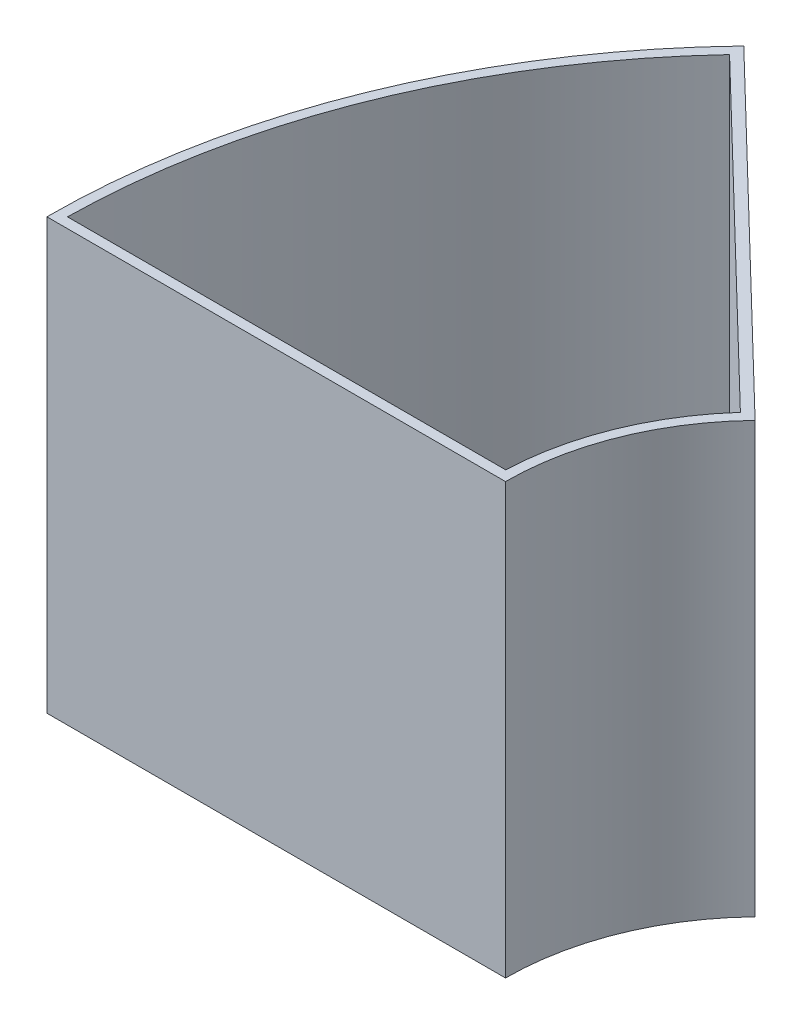
ISO-10303-21;
HEADER;
FILE_DESCRIPTION(('STEP AP214'),'2;1');
FILE_NAME('part.step','',(''),(''),'','','');
FILE_SCHEMA(('AUTOMOTIVE_DESIGN { 1 0 10303 214 1 1 1 1 }'));
ENDSEC;
DATA;
#1=APPLICATION_CONTEXT('core data for automotive mechanical design processes');
#2=APPLICATION_PROTOCOL_DEFINITION('international standard','automotive_design',2000,#1);
#3=PRODUCT_CONTEXT('',#1,'mechanical');
#4=PRODUCT('Part','Part','',(#3));
#5=PRODUCT_RELATED_PRODUCT_CATEGORY('part','',(#4));
#6=PRODUCT_DEFINITION_FORMATION('','',#4);
#7=PRODUCT_DEFINITION_CONTEXT('part definition',#1,'design');
#8=PRODUCT_DEFINITION('design','',#6,#7);
#9=PRODUCT_DEFINITION_SHAPE('','',#8);
#10=(LENGTH_UNIT() NAMED_UNIT(*) SI_UNIT(.MILLI.,.METRE.));
#11=(NAMED_UNIT(*) PLANE_ANGLE_UNIT() SI_UNIT($,.RADIAN.));
#12=(NAMED_UNIT(*) SI_UNIT($,.STERADIAN.) SOLID_ANGLE_UNIT());
#13=UNCERTAINTY_MEASURE_WITH_UNIT(LENGTH_MEASURE(1.E-05),#10,'distance_accuracy_value','');
#14=(GEOMETRIC_REPRESENTATION_CONTEXT(3) GLOBAL_UNCERTAINTY_ASSIGNED_CONTEXT((#13)) GLOBAL_UNIT_ASSIGNED_CONTEXT((#10,
#11,#12)) REPRESENTATION_CONTEXT('',''));
#15=CARTESIAN_POINT('',(0.,0.,0.));
#16=DIRECTION('',(0.,0.,1.));
#17=DIRECTION('',(1.,0.,0.));
#18=AXIS2_PLACEMENT_3D('',#15,#16,#17);
#19=CARTESIAN_POINT('',(0.,-2.,0.));
#20=DIRECTION('',(0.,-1.,0.));
#21=DIRECTION('',(0.,0.,-1.));
#22=AXIS2_PLACEMENT_3D('',#19,#20,#21);
#23=PLANE('',#22);
#24=CARTESIAN_POINT('',(0.,-2.,0.));
#25=DIRECTION('',(0.,1.,0.));
#26=DIRECTION('',(0.,0.,-1.));
#27=AXIS2_PLACEMENT_3D('',#24,#25,#26);
#28=CIRCLE('',#27,25.);
#29=CARTESIAN_POINT('',(-17.9834950084663,-2.,-17.366459261475));
#30=VERTEX_POINT('',#29);
#31=CARTESIAN_POINT('',(-25.,-2.,0.));
#32=VERTEX_POINT('',#31);
#33=EDGE_CURVE('E146',#30,#32,#28,.T.);
#34=ORIENTED_EDGE('',*,*,#33,.T.);
#35=DIRECTION('',(-1.,0.,0.));
#36=VECTOR('',#35,1.);
#37=CARTESIAN_POINT('',(-25.,-2.,0.));
#38=LINE('',#37,#36);
#39=CARTESIAN_POINT('',(-69.8,-2.,0.));
#40=VERTEX_POINT('',#39);
#41=EDGE_CURVE('E150',#32,#40,#38,.T.);
#42=ORIENTED_EDGE('',*,*,#41,.T.);
#43=CARTESIAN_POINT('',(0.,-2.,0.));
#44=DIRECTION('',(0.,-1.,0.));
#45=DIRECTION('',(0.,0.,-1.));
#46=AXIS2_PLACEMENT_3D('',#43,#44,#45);
#47=CIRCLE('',#46,69.7999999999999);
#48=CARTESIAN_POINT('',(-50.2099180636378,-2.,-48.4871542580381));
#49=VERTEX_POINT('',#48);
#50=EDGE_CURVE('E158',#40,#49,#47,.T.);
#51=ORIENTED_EDGE('',*,*,#50,.T.);
#52=DIRECTION('',(0.71933980033865,0.,0.694658370458998));
#53=VECTOR('',#52,1.);
#54=CARTESIAN_POINT('',(-17.9834950084663,-2.,-17.366459261475));
#55=LINE('',#54,#53);
#56=EDGE_CURVE('E161',#49,#30,#55,.T.);
#57=ORIENTED_EDGE('',*,*,#56,.T.);
#58=EDGE_LOOP('',(#34,#42,#51,#57));
#59=FACE_BOUND('',#58,.T.);
#60=DIRECTION('',(-0.819152044288988,0.,-0.573576436351052));
#61=VECTOR('',#60,1.);
#62=CARTESIAN_POINT('',(-38.9097221037269,-2.,-27.244880726675));
#63=LINE('',#62,#61);
#64=CARTESIAN_POINT('',(-30.718201660837,-2.,-21.5091163631645));
#65=VERTEX_POINT('',#64);
#66=CARTESIAN_POINT('',(-38.9097221037269,-2.,-27.244880726675));
#67=VERTEX_POINT('',#66);
#68=EDGE_CURVE('E141',#65,#67,#63,.T.);
#69=ORIENTED_EDGE('',*,*,#68,.T.);
#70=CARTESIAN_POINT('',(4.5102810375397E-13,-2.,0.));
#71=DIRECTION('',(0.,1.,0.));
#72=DIRECTION('',(0.,0.,-1.));
#73=AXIS2_PLACEMENT_3D('',#70,#71,#72);
#74=CIRCLE('',#73,47.5000000000004);
#75=CARTESIAN_POINT('',(-46.915196178269,-2.,-7.43063708941125));
#76=VERTEX_POINT('',#75);
#77=EDGE_CURVE('E52',#67,#76,#74,.T.);
#78=ORIENTED_EDGE('',*,*,#77,.T.);
#79=DIRECTION('',(0.987688340595137,0.,0.156434465040237));
#80=VECTOR('',#79,1.);
#81=CARTESIAN_POINT('',(-46.915196178269,-2.,-7.43063708941125));
#82=LINE('',#81,#80);
#83=CARTESIAN_POINT('',(-37.0383127723176,-2.,-5.86629243900886));
#84=VERTEX_POINT('',#83);
#85=EDGE_CURVE('E145',#76,#84,#82,.T.);
#86=ORIENTED_EDGE('',*,*,#85,.T.);
#87=CARTESIAN_POINT('',(0.,-2.,0.));
#88=DIRECTION('',(0.,-1.,0.));
#89=DIRECTION('',(0.,0.,-1.));
#90=AXIS2_PLACEMENT_3D('',#87,#88,#89);
#91=CIRCLE('',#90,37.5000000000001);
#92=EDGE_CURVE('E417',#84,#65,#91,.T.);
#93=ORIENTED_EDGE('',*,*,#92,.T.);
#94=EDGE_LOOP('',(#69,#78,#86,#93));
#95=FACE_BOUND('',#94,.T.);
#96=ADVANCED_FACE('F37',(#59,#95),#23,.T.);
#97=CARTESIAN_POINT('',(0.,40.,0.));
#98=DIRECTION('',(0.,-1.,0.));
#99=DIRECTION('',(0.,0.,-1.));
#100=AXIS2_PLACEMENT_3D('',#97,#98,#99);
#101=PLANE('',#100);
#102=CARTESIAN_POINT('',(0.,40.,0.));
#103=DIRECTION('',(0.,-1.,0.));
#104=DIRECTION('',(0.,0.,-1.));
#105=AXIS2_PLACEMENT_3D('',#102,#103,#104);
#106=CIRCLE('',#105,25.);
#107=CARTESIAN_POINT('',(-25.,40.,0.));
#108=VERTEX_POINT('',#107);
#109=CARTESIAN_POINT('',(-17.9834950084663,40.,-17.366459261475));
#110=VERTEX_POINT('',#109);
#111=EDGE_CURVE('E171',#108,#110,#106,.T.);
#112=ORIENTED_EDGE('',*,*,#111,.T.);
#113=DIRECTION('',(-0.71933980033865,0.,-0.694658370458998));
#114=VECTOR('',#113,1.);
#115=CARTESIAN_POINT('',(-50.2099180636378,40.,-48.4871542580381));
#116=LINE('',#115,#114);
#117=CARTESIAN_POINT('',(-50.2099180636378,40.,-48.4871542580381));
#118=VERTEX_POINT('',#117);
#119=EDGE_CURVE('E194',#110,#118,#116,.T.);
#120=ORIENTED_EDGE('',*,*,#119,.T.);
#121=CARTESIAN_POINT('',(0.,40.,0.));
#122=DIRECTION('',(0.,1.,0.));
#123=DIRECTION('',(0.,0.,-1.));
#124=AXIS2_PLACEMENT_3D('',#121,#122,#123);
#125=CIRCLE('',#124,69.8);
#126=CARTESIAN_POINT('',(-69.8,40.,0.));
#127=VERTEX_POINT('',#126);
#128=EDGE_CURVE('E196',#118,#127,#125,.T.);
#129=ORIENTED_EDGE('',*,*,#128,.T.);
#130=DIRECTION('',(1.,0.,0.));
#131=VECTOR('',#130,1.);
#132=CARTESIAN_POINT('',(-25.,40.,0.));
#133=LINE('',#132,#131);
#134=EDGE_CURVE('E198',#127,#108,#133,.T.);
#135=ORIENTED_EDGE('',*,*,#134,.T.);
#136=EDGE_LOOP('',(#112,#120,#129,#135));
#137=FACE_BOUND('',#136,.T.);
#138=CARTESIAN_POINT('',(0.,40.,0.));
#139=DIRECTION('',(0.,-1.,0.));
#140=DIRECTION('',(0.,0.,-1.));
#141=AXIS2_PLACEMENT_3D('',#138,#139,#140);
#142=CIRCLE('',#141,26.);
#143=CARTESIAN_POINT('',(-25.9807621135332,40.,-1.));
#144=VERTEX_POINT('',#143);
#145=CARTESIAN_POINT('',(-19.3836546018539,40.,-17.3284140727312));
#146=VERTEX_POINT('',#145);
#147=EDGE_CURVE('E185',#144,#146,#142,.T.);
#148=ORIENTED_EDGE('',*,*,#147,.F.);
#149=DIRECTION('',(1.,0.,0.));
#150=VECTOR('',#149,1.);
#151=CARTESIAN_POINT('',(0.,40.,-1.));
#152=LINE('',#151,#150);
#153=CARTESIAN_POINT('',(-68.7927321742639,40.,-0.999999999999995));
#154=VERTEX_POINT('',#153);
#155=EDGE_CURVE('E176',#154,#144,#152,.T.);
#156=ORIENTED_EDGE('',*,*,#155,.F.);
#157=CARTESIAN_POINT('',(0.,40.,0.));
#158=DIRECTION('',(0.,-1.,0.));
#159=DIRECTION('',(0.,0.,-1.));
#160=AXIS2_PLACEMENT_3D('',#157,#158,#159);
#161=CIRCLE('',#160,68.8);
#162=CARTESIAN_POINT('',(-50.1800085974442,40.,-47.0681074312578));
#163=VERTEX_POINT('',#162);
#164=EDGE_CURVE('E189',#163,#154,#161,.F.);
#165=ORIENTED_EDGE('',*,*,#164,.F.);
#166=DIRECTION('',(-0.71933980033865,0.,-0.694658370458998));
#167=VECTOR('',#166,1.);
#168=CARTESIAN_POINT('',(-0.694658370458983,40.,0.719339800338656));
#169=LINE('',#168,#167);
#170=EDGE_CURVE('E187',#146,#163,#169,.T.);
#171=ORIENTED_EDGE('',*,*,#170,.F.);
#172=EDGE_LOOP('',(#148,#156,#165,#171));
#173=FACE_BOUND('',#172,.T.);
#174=ADVANCED_FACE('F224',(#137,#173),#101,.F.);
#175=CARTESIAN_POINT('',(0.,40.,0.));
#176=DIRECTION('',(0.,-1.,0.));
#177=DIRECTION('',(0.,0.,-1.));
#178=AXIS2_PLACEMENT_3D('',#175,#176,#177);
#179=CYLINDRICAL_SURFACE('',#178,25.);
#180=DIRECTION('',(0.,-1.,0.));
#181=VECTOR('',#180,1.);
#182=CARTESIAN_POINT('',(-25.,40.,0.));
#183=LINE('',#182,#181);
#184=EDGE_CURVE('E200',#108,#32,#183,.T.);
#185=ORIENTED_EDGE('',*,*,#184,.T.);
#186=ORIENTED_EDGE('',*,*,#33,.F.);
#187=DIRECTION('',(0.,-1.,0.));
#188=VECTOR('',#187,1.);
#189=CARTESIAN_POINT('',(-17.9834950084663,40.,-17.366459261475));
#190=LINE('',#189,#188);
#191=EDGE_CURVE('E11',#110,#30,#190,.T.);
#192=ORIENTED_EDGE('',*,*,#191,.F.);
#193=ORIENTED_EDGE('',*,*,#111,.F.);
#194=EDGE_LOOP('',(#185,#186,#192,#193));
#195=FACE_BOUND('',#194,.T.);
#196=ADVANCED_FACE('F39',(#195),#179,.F.);
#197=CARTESIAN_POINT('',(-50.2099180636378,40.,-48.4871542580381));
#198=DIRECTION('',(-0.694658370458998,0.,0.71933980033865));
#199=DIRECTION('',(0.71933980033865,0.,0.694658370458998));
#200=AXIS2_PLACEMENT_3D('',#197,#198,#199);
#201=PLANE('',#200);
#202=ORIENTED_EDGE('',*,*,#191,.T.);
#203=ORIENTED_EDGE('',*,*,#56,.F.);
#204=DIRECTION('',(0.,-1.,0.));
#205=VECTOR('',#204,1.);
#206=CARTESIAN_POINT('',(-50.2099180636378,40.,-48.4871542580381));
#207=LINE('',#206,#205);
#208=EDGE_CURVE('E45',#118,#49,#207,.T.);
#209=ORIENTED_EDGE('',*,*,#208,.F.);
#210=ORIENTED_EDGE('',*,*,#119,.F.);
#211=EDGE_LOOP('',(#202,#203,#209,#210));
#212=FACE_BOUND('',#211,.T.);
#213=ADVANCED_FACE('F215',(#212),#201,.F.);
#214=CARTESIAN_POINT('',(0.,40.,0.));
#215=DIRECTION('',(0.,-1.,0.));
#216=DIRECTION('',(0.,0.,-1.));
#217=AXIS2_PLACEMENT_3D('',#214,#215,#216);
#218=CYLINDRICAL_SURFACE('',#217,69.8);
#219=ORIENTED_EDGE('',*,*,#208,.T.);
#220=ORIENTED_EDGE('',*,*,#50,.F.);
#221=DIRECTION('',(0.,-1.,0.));
#222=VECTOR('',#221,1.);
#223=CARTESIAN_POINT('',(-69.8,40.,0.));
#224=LINE('',#223,#222);
#225=EDGE_CURVE('E202',#127,#40,#224,.T.);
#226=ORIENTED_EDGE('',*,*,#225,.F.);
#227=ORIENTED_EDGE('',*,*,#128,.F.);
#228=EDGE_LOOP('',(#219,#220,#226,#227));
#229=FACE_BOUND('',#228,.T.);
#230=ADVANCED_FACE('F207',(#229),#218,.T.);
#231=CARTESIAN_POINT('',(-25.,40.,0.));
#232=DIRECTION('',(0.,0.,-1.));
#233=DIRECTION('',(-1.,0.,0.));
#234=AXIS2_PLACEMENT_3D('',#231,#232,#233);
#235=PLANE('',#234);
#236=ORIENTED_EDGE('',*,*,#225,.T.);
#237=ORIENTED_EDGE('',*,*,#41,.F.);
#238=ORIENTED_EDGE('',*,*,#184,.F.);
#239=ORIENTED_EDGE('',*,*,#134,.F.);
#240=EDGE_LOOP('',(#236,#237,#238,#239));
#241=FACE_BOUND('',#240,.T.);
#242=ADVANCED_FACE('F222',(#241),#235,.F.);
#243=CARTESIAN_POINT('',(0.,40.,0.));
#244=DIRECTION('',(0.,-1.,0.));
#245=DIRECTION('',(0.,0.,-1.));
#246=AXIS2_PLACEMENT_3D('',#243,#244,#245);
#247=CYLINDRICAL_SURFACE('',#246,26.);
#248=CARTESIAN_POINT('',(0.,1.,0.));
#249=DIRECTION('',(0.,-1.,0.));
#250=DIRECTION('',(0.,0.,-1.));
#251=AXIS2_PLACEMENT_3D('',#248,#249,#250);
#252=CIRCLE('',#251,26.);
#253=CARTESIAN_POINT('',(-25.9807621135332,1.,-1.));
#254=VERTEX_POINT('',#253);
#255=CARTESIAN_POINT('',(-19.3836546018539,1.,-17.3284140727312));
#256=VERTEX_POINT('',#255);
#257=EDGE_CURVE('E164',#254,#256,#252,.T.);
#258=ORIENTED_EDGE('',*,*,#257,.F.);
#259=DIRECTION('',(0.,-1.,0.));
#260=VECTOR('',#259,1.);
#261=CARTESIAN_POINT('',(-25.9807621135332,40.,-1.));
#262=LINE('',#261,#260);
#263=EDGE_CURVE('E173',#144,#254,#262,.T.);
#264=ORIENTED_EDGE('',*,*,#263,.F.);
#265=ORIENTED_EDGE('',*,*,#147,.T.);
#266=DIRECTION('',(0.,-1.,0.));
#267=VECTOR('',#266,1.);
#268=CARTESIAN_POINT('',(-19.3836546018539,40.,-17.3284140727312));
#269=LINE('',#268,#267);
#270=EDGE_CURVE('E168',#146,#256,#269,.T.);
#271=ORIENTED_EDGE('',*,*,#270,.T.);
#272=EDGE_LOOP('',(#258,#264,#265,#271));
#273=FACE_BOUND('',#272,.T.);
#274=ADVANCED_FACE('F236',(#273),#247,.T.);
#275=CARTESIAN_POINT('',(-50.9045764340968,40.,-47.7678144576994));
#276=DIRECTION('',(-0.694658370458998,0.,0.71933980033865));
#277=DIRECTION('',(0.71933980033865,0.,0.694658370458998));
#278=AXIS2_PLACEMENT_3D('',#275,#276,#277);
#279=PLANE('',#278);
#280=DIRECTION('',(-0.71933980033865,0.,-0.694658370458998));
#281=VECTOR('',#280,1.);
#282=CARTESIAN_POINT('',(-0.694658370458983,1.,0.719339800338656));
#283=LINE('',#282,#281);
#284=CARTESIAN_POINT('',(-50.1800085974442,1.,-47.0681074312578));
#285=VERTEX_POINT('',#284);
#286=EDGE_CURVE('E167',#256,#285,#283,.T.);
#287=ORIENTED_EDGE('',*,*,#286,.F.);
#288=ORIENTED_EDGE('',*,*,#270,.F.);
#289=ORIENTED_EDGE('',*,*,#170,.T.);
#290=DIRECTION('',(0.,-1.,0.));
#291=VECTOR('',#290,1.);
#292=CARTESIAN_POINT('',(-50.1800085974442,40.,-47.0681074312578));
#293=LINE('',#292,#291);
#294=EDGE_CURVE('E172',#163,#285,#293,.T.);
#295=ORIENTED_EDGE('',*,*,#294,.T.);
#296=EDGE_LOOP('',(#287,#288,#289,#295));
#297=FACE_BOUND('',#296,.T.);
#298=ADVANCED_FACE('F238',(#297),#279,.T.);
#299=CARTESIAN_POINT('',(0.,40.,0.));
#300=DIRECTION('',(0.,-1.,0.));
#301=DIRECTION('',(0.,0.,-1.));
#302=AXIS2_PLACEMENT_3D('',#299,#300,#301);
#303=CYLINDRICAL_SURFACE('',#302,68.8);
#304=CARTESIAN_POINT('',(0.,1.,0.));
#305=DIRECTION('',(0.,-1.,0.));
#306=DIRECTION('',(0.,0.,-1.));
#307=AXIS2_PLACEMENT_3D('',#304,#305,#306);
#308=CIRCLE('',#307,68.8);
#309=CARTESIAN_POINT('',(-68.7927321742639,1.,-0.999999999999995));
#310=VERTEX_POINT('',#309);
#311=EDGE_CURVE('E178',#285,#310,#308,.F.);
#312=ORIENTED_EDGE('',*,*,#311,.F.);
#313=ORIENTED_EDGE('',*,*,#294,.F.);
#314=ORIENTED_EDGE('',*,*,#164,.T.);
#315=DIRECTION('',(0.,-1.,0.));
#316=VECTOR('',#315,1.);
#317=CARTESIAN_POINT('',(-68.7927321742639,40.,-0.999999999999995));
#318=LINE('',#317,#316);
#319=EDGE_CURVE('E60',#154,#310,#318,.T.);
#320=ORIENTED_EDGE('',*,*,#319,.T.);
#321=EDGE_LOOP('',(#312,#313,#314,#320));
#322=FACE_BOUND('',#321,.T.);
#323=ADVANCED_FACE('F245',(#322),#303,.F.);
#324=CARTESIAN_POINT('',(-25.,40.,-1.));
#325=DIRECTION('',(0.,0.,-1.));
#326=DIRECTION('',(-1.,0.,0.));
#327=AXIS2_PLACEMENT_3D('',#324,#325,#326);
#328=PLANE('',#327);
#329=DIRECTION('',(1.,0.,0.));
#330=VECTOR('',#329,1.);
#331=CARTESIAN_POINT('',(0.,1.,-1.));
#332=LINE('',#331,#330);
#333=EDGE_CURVE('E182',#310,#254,#332,.T.);
#334=ORIENTED_EDGE('',*,*,#333,.F.);
#335=ORIENTED_EDGE('',*,*,#319,.F.);
#336=ORIENTED_EDGE('',*,*,#155,.T.);
#337=ORIENTED_EDGE('',*,*,#263,.T.);
#338=EDGE_LOOP('',(#334,#335,#336,#337));
#339=FACE_BOUND('',#338,.T.);
#340=ADVANCED_FACE('F243',(#339),#328,.T.);
#341=CARTESIAN_POINT('',(0.,1.,0.));
#342=DIRECTION('',(0.,-1.,0.));
#343=DIRECTION('',(0.,0.,-1.));
#344=AXIS2_PLACEMENT_3D('',#341,#342,#343);
#345=PLANE('',#344);
#346=CARTESIAN_POINT('',(-55.6310312740072,1.,-22.4763956049547));
#347=DIRECTION('',(0.,1.,0.));
#348=DIRECTION('',(0.,0.,1.));
#349=AXIS2_PLACEMENT_3D('',#346,#347,#348);
#350=CIRCLE('',#349,2.5);
#351=CARTESIAN_POINT('',(-55.6310312740072,1.,-19.9763956049547));
#352=VERTEX_POINT('',#351);
#353=EDGE_CURVE('E407',#352,#352,#350,.T.);
#354=ORIENTED_EDGE('',*,*,#353,.F.);
#355=EDGE_LOOP('',(#354));
#356=FACE_BOUND('',#355,.T.);
#357=ORIENTED_EDGE('',*,*,#257,.T.);
#358=ORIENTED_EDGE('',*,*,#286,.T.);
#359=ORIENTED_EDGE('',*,*,#311,.T.);
#360=ORIENTED_EDGE('',*,*,#333,.T.);
#361=EDGE_LOOP('',(#357,#358,#359,#360));
#362=FACE_BOUND('',#361,.T.);
#363=ADVANCED_FACE('F242',(#356,#362),#345,.F.);
#364=CARTESIAN_POINT('',(4.5102810375397E-13,0.,0.));
#365=DIRECTION('',(0.,-1.,0.));
#366=DIRECTION('',(0.,0.,-1.));
#367=AXIS2_PLACEMENT_3D('',#364,#365,#366);
#368=CYLINDRICAL_SURFACE('',#367,47.5000000000004);
#369=ORIENTED_EDGE('',*,*,#77,.F.);
#370=DIRECTION('',(0.,-1.,0.));
#371=VECTOR('',#370,1.);
#372=CARTESIAN_POINT('',(-38.9097221037269,0.,-27.244880726675));
#373=LINE('',#372,#371);
#374=CARTESIAN_POINT('',(-38.9097221037269,0.,-27.244880726675));
#375=VERTEX_POINT('',#374);
#376=EDGE_CURVE('E140',#375,#67,#373,.T.);
#377=ORIENTED_EDGE('',*,*,#376,.F.);
#378=CARTESIAN_POINT('',(4.5102810375397E-13,0.,0.));
#379=DIRECTION('',(0.,1.,0.));
#380=DIRECTION('',(0.,0.,-1.));
#381=AXIS2_PLACEMENT_3D('',#378,#379,#380);
#382=CIRCLE('',#381,47.5000000000004);
#383=CARTESIAN_POINT('',(-46.915196178269,0.,-7.43063708941125));
#384=VERTEX_POINT('',#383);
#385=EDGE_CURVE('E132',#375,#384,#382,.T.);
#386=ORIENTED_EDGE('',*,*,#385,.T.);
#387=DIRECTION('',(0.,-1.,0.));
#388=VECTOR('',#387,1.);
#389=CARTESIAN_POINT('',(-46.915196178269,0.,-7.43063708941125));
#390=LINE('',#389,#388);
#391=EDGE_CURVE('E139',#384,#76,#390,.T.);
#392=ORIENTED_EDGE('',*,*,#391,.T.);
#393=EDGE_LOOP('',(#369,#377,#386,#392));
#394=FACE_BOUND('',#393,.T.);
#395=ADVANCED_FACE('F138',(#394),#368,.F.);
#396=CARTESIAN_POINT('',(-46.915196178269,0.,-7.43063708941125));
#397=DIRECTION('',(0.156434465040237,0.,-0.987688340595137));
#398=DIRECTION('',(-0.987688340595137,0.,-0.156434465040237));
#399=AXIS2_PLACEMENT_3D('',#396,#397,#398);
#400=PLANE('',#399);
#401=ORIENTED_EDGE('',*,*,#85,.F.);
#402=ORIENTED_EDGE('',*,*,#391,.F.);
#403=DIRECTION('',(0.987688340595137,0.,0.156434465040237));
#404=VECTOR('',#403,1.);
#405=CARTESIAN_POINT('',(-46.915196178269,0.,-7.43063708941125));
#406=LINE('',#405,#404);
#407=CARTESIAN_POINT('',(-37.0383127723176,0.,-5.86629243900886));
#408=VERTEX_POINT('',#407);
#409=EDGE_CURVE('E128',#384,#408,#406,.T.);
#410=ORIENTED_EDGE('',*,*,#409,.T.);
#411=DIRECTION('',(0.,-1.,0.));
#412=VECTOR('',#411,1.);
#413=CARTESIAN_POINT('',(-37.0383127723176,0.,-5.86629243900886));
#414=LINE('',#413,#412);
#415=EDGE_CURVE('E147',#408,#84,#414,.T.);
#416=ORIENTED_EDGE('',*,*,#415,.T.);
#417=EDGE_LOOP('',(#401,#402,#410,#416));
#418=FACE_BOUND('',#417,.T.);
#419=ADVANCED_FACE('F143',(#418),#400,.T.);
#420=CARTESIAN_POINT('',(0.,0.,0.));
#421=DIRECTION('',(0.,-1.,0.));
#422=DIRECTION('',(0.,0.,-1.));
#423=AXIS2_PLACEMENT_3D('',#420,#421,#422);
#424=CYLINDRICAL_SURFACE('',#423,37.5000000000001);
#425=ORIENTED_EDGE('',*,*,#92,.F.);
#426=ORIENTED_EDGE('',*,*,#415,.F.);
#427=CARTESIAN_POINT('',(0.,0.,0.));
#428=DIRECTION('',(0.,-1.,0.));
#429=DIRECTION('',(0.,0.,-1.));
#430=AXIS2_PLACEMENT_3D('',#427,#428,#429);
#431=CIRCLE('',#430,37.5000000000001);
#432=CARTESIAN_POINT('',(-30.718201660837,0.,-21.5091163631645));
#433=VERTEX_POINT('',#432);
#434=EDGE_CURVE('E133',#408,#433,#431,.T.);
#435=ORIENTED_EDGE('',*,*,#434,.T.);
#436=DIRECTION('',(0.,-1.,0.));
#437=VECTOR('',#436,1.);
#438=CARTESIAN_POINT('',(-30.718201660837,0.,-21.5091163631645));
#439=LINE('',#438,#437);
#440=EDGE_CURVE('E152',#433,#65,#439,.T.);
#441=ORIENTED_EDGE('',*,*,#440,.T.);
#442=EDGE_LOOP('',(#425,#426,#435,#441));
#443=FACE_BOUND('',#442,.T.);
#444=ADVANCED_FACE('F336',(#443),#424,.T.);
#445=CARTESIAN_POINT('',(-38.9097221037269,0.,-27.244880726675));
#446=DIRECTION('',(-0.573576436351052,0.,0.819152044288988));
#447=DIRECTION('',(0.819152044288988,0.,0.573576436351052));
#448=AXIS2_PLACEMENT_3D('',#445,#446,#447);
#449=PLANE('',#448);
#450=ORIENTED_EDGE('',*,*,#68,.F.);
#451=ORIENTED_EDGE('',*,*,#440,.F.);
#452=DIRECTION('',(-0.819152044288988,0.,-0.573576436351052));
#453=VECTOR('',#452,1.);
#454=CARTESIAN_POINT('',(-38.9097221037269,0.,-27.244880726675));
#455=LINE('',#454,#453);
#456=EDGE_CURVE('E414',#433,#375,#455,.T.);
#457=ORIENTED_EDGE('',*,*,#456,.T.);
#458=ORIENTED_EDGE('',*,*,#376,.T.);
#459=EDGE_LOOP('',(#450,#451,#457,#458));
#460=FACE_BOUND('',#459,.T.);
#461=ADVANCED_FACE('F345',(#460),#449,.T.);
#462=CARTESIAN_POINT('',(4.5102810375397E-13,0.,0.));
#463=DIRECTION('',(0.,-1.,0.));
#464=DIRECTION('',(0.,0.,-1.));
#465=AXIS2_PLACEMENT_3D('',#462,#463,#464);
#466=PLANE('',#465);
#467=ORIENTED_EDGE('',*,*,#385,.F.);
#468=ORIENTED_EDGE('',*,*,#456,.F.);
#469=ORIENTED_EDGE('',*,*,#434,.F.);
#470=ORIENTED_EDGE('',*,*,#409,.F.);
#471=EDGE_LOOP('',(#467,#468,#469,#470));
#472=FACE_BOUND('',#471,.T.);
#473=ADVANCED_FACE('F130',(#472),#466,.T.);
#474=CARTESIAN_POINT('',(-55.6310312740072,-1.,-22.4763956049547));
#475=DIRECTION('',(0.,1.,0.));
#476=DIRECTION('',(0.,0.,1.));
#477=AXIS2_PLACEMENT_3D('',#474,#475,#476);
#478=CYLINDRICAL_SURFACE('',#477,2.5);
#479=CARTESIAN_POINT('',(-55.6310312740072,-1.,-22.4763956049547));
#480=DIRECTION('',(0.,1.,0.));
#481=DIRECTION('',(0.,0.,1.));
#482=AXIS2_PLACEMENT_3D('',#479,#480,#481);
#483=CIRCLE('',#482,2.5);
#484=CARTESIAN_POINT('',(-55.6310312740072,-1.,-19.9763956049547));
#485=VERTEX_POINT('',#484);
#486=EDGE_CURVE('E406',#485,#485,#483,.T.);
#487=ORIENTED_EDGE('',*,*,#486,.F.);
#488=EDGE_LOOP('',(#487));
#489=FACE_BOUND('',#488,.T.);
#490=ORIENTED_EDGE('',*,*,#353,.T.);
#491=EDGE_LOOP('',(#490));
#492=FACE_BOUND('',#491,.T.);
#493=ADVANCED_FACE('F366',(#489,#492),#478,.F.);
#494=CARTESIAN_POINT('',(-55.6310312740072,-1.,-22.4763956049547));
#495=DIRECTION('',(0.,1.,0.));
#496=DIRECTION('',(0.,0.,1.));
#497=AXIS2_PLACEMENT_3D('',#494,#495,#496);
#498=PLANE('',#497);
#499=ORIENTED_EDGE('',*,*,#486,.T.);
#500=EDGE_LOOP('',(#499));
#501=FACE_BOUND('',#500,.T.);
#502=ADVANCED_FACE('F381',(#501),#498,.T.);
#503=CLOSED_SHELL('',(#96,#174,#196,#213,#230,#242,#274,#298,#323,#340,#363,#395,#419,#444,#461,
#473,#493,#502));
#504=MANIFOLD_SOLID_BREP('B2',#503);
#505=ADVANCED_BREP_SHAPE_REPRESENTATION('',(#18,#504),#14);
#506=SHAPE_DEFINITION_REPRESENTATION(#9,#505);
ENDSEC;
END-ISO-10303-21;
